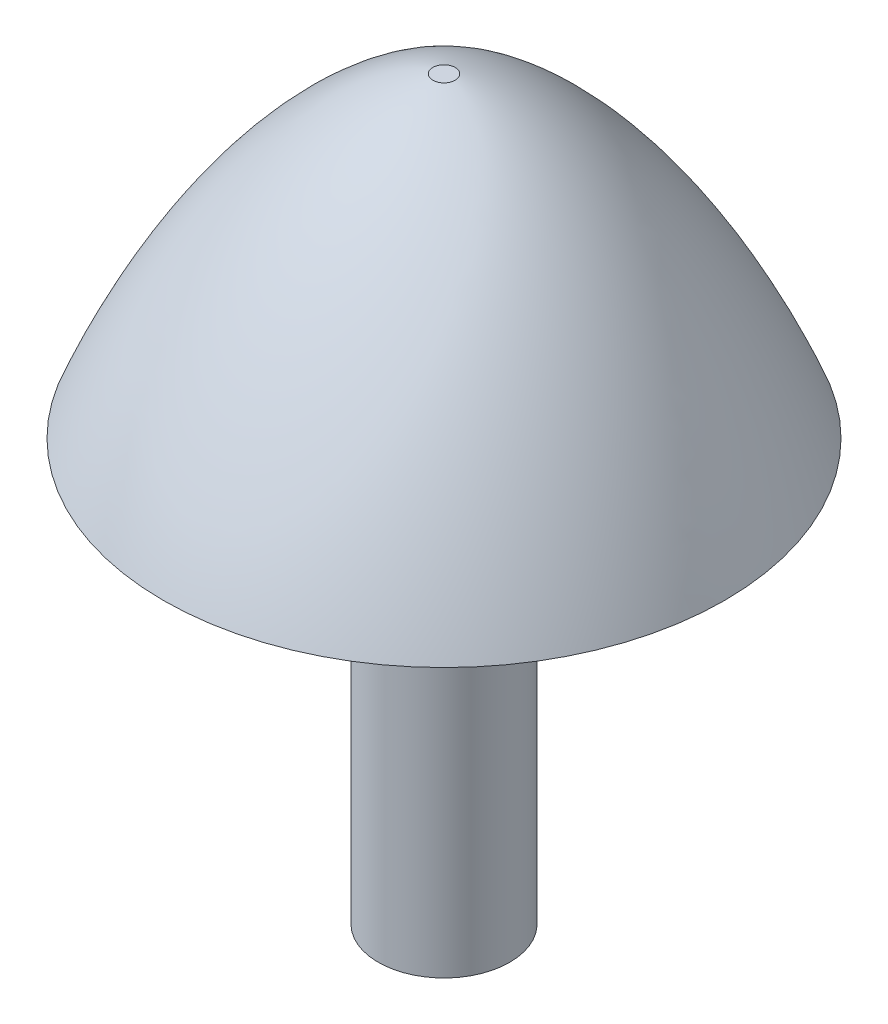
ISO-10303-21;
HEADER;
FILE_DESCRIPTION(('STEP AP214'),'2;1');
FILE_NAME('part.step','',(''),(''),'','','');
FILE_SCHEMA(('AUTOMOTIVE_DESIGN { 1 0 10303 214 1 1 1 1 }'));
ENDSEC;
DATA;
#1=APPLICATION_CONTEXT('core data for automotive mechanical design processes');
#2=APPLICATION_PROTOCOL_DEFINITION('international standard','automotive_design',2000,#1);
#3=PRODUCT_CONTEXT('',#1,'mechanical');
#4=PRODUCT('Part','Part','',(#3));
#5=PRODUCT_RELATED_PRODUCT_CATEGORY('part','',(#4));
#6=PRODUCT_DEFINITION_FORMATION('','',#4);
#7=PRODUCT_DEFINITION_CONTEXT('part definition',#1,'design');
#8=PRODUCT_DEFINITION('design','',#6,#7);
#9=PRODUCT_DEFINITION_SHAPE('','',#8);
#10=(LENGTH_UNIT() NAMED_UNIT(*) SI_UNIT(.MILLI.,.METRE.));
#11=(NAMED_UNIT(*) PLANE_ANGLE_UNIT() SI_UNIT($,.RADIAN.));
#12=(NAMED_UNIT(*) SI_UNIT($,.STERADIAN.) SOLID_ANGLE_UNIT());
#13=UNCERTAINTY_MEASURE_WITH_UNIT(LENGTH_MEASURE(1.E-05),#10,'distance_accuracy_value','');
#14=(GEOMETRIC_REPRESENTATION_CONTEXT(3) GLOBAL_UNCERTAINTY_ASSIGNED_CONTEXT((#13)) GLOBAL_UNIT_ASSIGNED_CONTEXT((#10,
#11,#12)) REPRESENTATION_CONTEXT('',''));
#15=CARTESIAN_POINT('',(0.,0.,0.));
#16=DIRECTION('',(0.,0.,1.));
#17=DIRECTION('',(1.,0.,0.));
#18=AXIS2_PLACEMENT_3D('',#15,#16,#17);
#19=CARTESIAN_POINT('',(20.,0.,0.));
#20=CARTESIAN_POINT('',(19.406701728429,11.2194562344957,0.));
#21=CARTESIAN_POINT('',(10.7603395044872,29.131046737424,0.));
#22=CARTESIAN_POINT('',(0.671450482917856,31.75,0.));
#23=B_SPLINE_CURVE_WITH_KNOTS('',3,(#19,#20,#21,#22),.UNSPECIFIED.,.F.,.F.,(4,4),
(0.132414505536626,1.),.UNSPECIFIED.);
#24=CARTESIAN_POINT('',(0.,0.,0.));
#25=DIRECTION('',(0.,-1.,0.));
#26=AXIS1_PLACEMENT('',#24,#25);
#27=SURFACE_OF_REVOLUTION('',#23,#26);
#28=CARTESIAN_POINT('',(0.,12.7000000000004,0.));
#29=DIRECTION('',(0.,-1.,0.));
#30=DIRECTION('',(0.,0.,-1.));
#31=AXIS2_PLACEMENT_3D('',#28,#29,#30);
#32=CIRCLE('',#31,16.9418288123476);
#33=CARTESIAN_POINT('',(0.,12.7000000000004,-16.9418288123476));
#34=VERTEX_POINT('',#33);
#35=EDGE_CURVE('E41',#34,#34,#32,.T.);
#36=ORIENTED_EDGE('',*,*,#35,.F.);
#37=EDGE_LOOP('',(#36));
#38=FACE_BOUND('',#37,.T.);
#39=CARTESIAN_POINT('',(0.,31.75,0.));
#40=DIRECTION('',(0.,-1.,0.));
#41=DIRECTION('',(0.,0.,-1.));
#42=AXIS2_PLACEMENT_3D('',#39,#40,#41);
#43=CIRCLE('',#42,0.671450482917856);
#44=CARTESIAN_POINT('',(0.,31.75,-0.671450482917856));
#45=VERTEX_POINT('',#44);
#46=EDGE_CURVE('E46',#45,#45,#43,.T.);
#47=ORIENTED_EDGE('',*,*,#46,.T.);
#48=EDGE_LOOP('',(#47));
#49=FACE_BOUND('',#48,.T.);
#50=ADVANCED_FACE('F37',(#38,#49),#27,.F.);
#51=CARTESIAN_POINT('',(0.671450482917856,31.75,0.));
#52=DIRECTION('',(0.,1.,0.));
#53=DIRECTION('',(0.,0.,1.));
#54=AXIS2_PLACEMENT_3D('',#51,#52,#53);
#55=PLANE('',#54);
#56=ORIENTED_EDGE('',*,*,#46,.F.);
#57=EDGE_LOOP('',(#56));
#58=FACE_BOUND('',#57,.T.);
#59=ADVANCED_FACE('F72',(#58),#55,.T.);
#60=CARTESIAN_POINT('',(-25.4422173680697,12.7,-20.));
#61=DIRECTION('',(0.,1.,0.));
#62=DIRECTION('',(-1.,0.,0.));
#63=AXIS2_PLACEMENT_3D('',#60,#61,#62);
#64=PLANE('',#63);
#65=CARTESIAN_POINT('',(0.,12.7,0.));
#66=DIRECTION('',(0.,-1.,0.));
#67=DIRECTION('',(1.,0.,0.));
#68=AXIS2_PLACEMENT_3D('',#65,#66,#67);
#69=CIRCLE('',#68,3.96875);
#70=CARTESIAN_POINT('',(3.96875,12.7,0.));
#71=VERTEX_POINT('',#70);
#72=EDGE_CURVE('E10',#71,#71,#69,.T.);
#73=ORIENTED_EDGE('',*,*,#72,.F.);
#74=EDGE_LOOP('',(#73));
#75=FACE_BOUND('',#74,.T.);
#76=ORIENTED_EDGE('',*,*,#35,.T.);
#77=EDGE_LOOP('',(#76));
#78=FACE_BOUND('',#77,.T.);
#79=ADVANCED_FACE('F68',(#75,#78),#64,.F.);
#80=CARTESIAN_POINT('',(0.,-12.7,0.));
#81=DIRECTION('',(0.,1.,0.));
#82=DIRECTION('',(-1.,0.,0.));
#83=AXIS2_PLACEMENT_3D('',#80,#81,#82);
#84=CYLINDRICAL_SURFACE('',#83,3.96875);
#85=CARTESIAN_POINT('',(0.,-12.7,0.));
#86=DIRECTION('',(0.,-1.,0.));
#87=DIRECTION('',(1.,0.,0.));
#88=AXIS2_PLACEMENT_3D('',#85,#86,#87);
#89=CIRCLE('',#88,3.96875);
#90=CARTESIAN_POINT('',(3.96875,-12.7,0.));
#91=VERTEX_POINT('',#90);
#92=EDGE_CURVE('E53',#91,#91,#89,.T.);
#93=ORIENTED_EDGE('',*,*,#92,.F.);
#94=EDGE_LOOP('',(#93));
#95=FACE_BOUND('',#94,.T.);
#96=ORIENTED_EDGE('',*,*,#72,.T.);
#97=EDGE_LOOP('',(#96));
#98=FACE_BOUND('',#97,.T.);
#99=ADVANCED_FACE('F80',(#95,#98),#84,.T.);
#100=CARTESIAN_POINT('',(0.,-12.7,0.));
#101=DIRECTION('',(0.,-1.,0.));
#102=DIRECTION('',(1.,0.,0.));
#103=AXIS2_PLACEMENT_3D('',#100,#101,#102);
#104=PLANE('',#103);
#105=ORIENTED_EDGE('',*,*,#92,.T.);
#106=EDGE_LOOP('',(#105));
#107=FACE_BOUND('',#106,.T.);
#108=ADVANCED_FACE('F86',(#107),#104,.T.);
#109=CLOSED_SHELL('',(#50,#59,#79,#99,#108));
#110=MANIFOLD_SOLID_BREP('B2',#109);
#111=ADVANCED_BREP_SHAPE_REPRESENTATION('',(#18,#110),#14);
#112=SHAPE_DEFINITION_REPRESENTATION(#9,#111);
ENDSEC;
END-ISO-10303-21;
